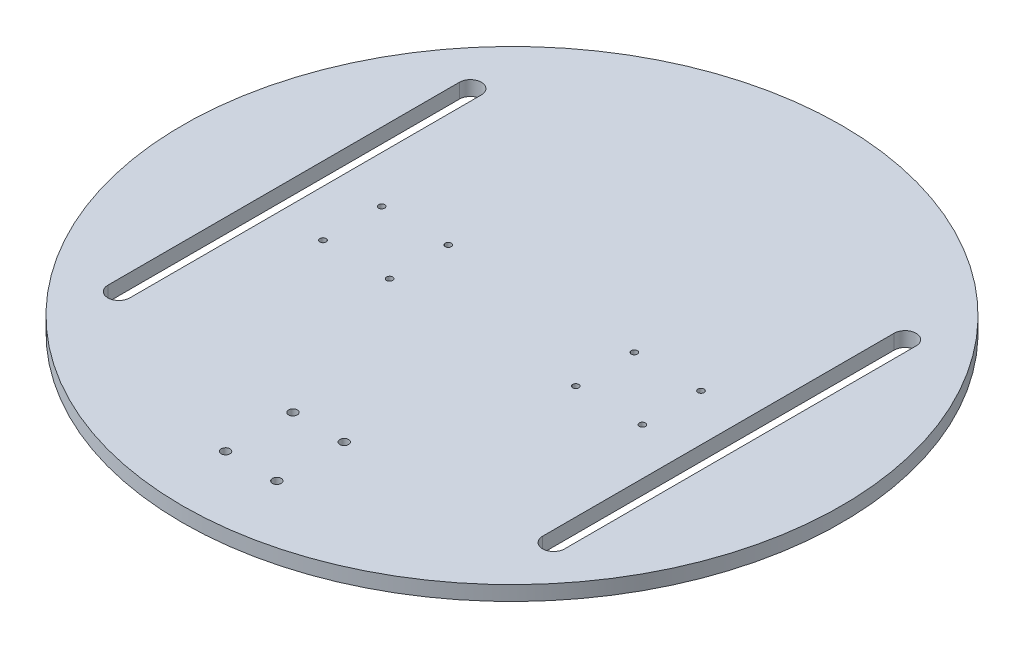
ISO-10303-21;
HEADER;
FILE_DESCRIPTION(('STEP AP214'),'2;1');
FILE_NAME('part.step','',(''),(''),'','','');
FILE_SCHEMA(('AUTOMOTIVE_DESIGN { 1 0 10303 214 1 1 1 1 }'));
ENDSEC;
DATA;
#1=APPLICATION_CONTEXT('core data for automotive mechanical design processes');
#2=APPLICATION_PROTOCOL_DEFINITION('international standard','automotive_design',2000,#1);
#3=PRODUCT_CONTEXT('',#1,'mechanical');
#4=PRODUCT('Part','Part','',(#3));
#5=PRODUCT_RELATED_PRODUCT_CATEGORY('part','',(#4));
#6=PRODUCT_DEFINITION_FORMATION('','',#4);
#7=PRODUCT_DEFINITION_CONTEXT('part definition',#1,'design');
#8=PRODUCT_DEFINITION('design','',#6,#7);
#9=PRODUCT_DEFINITION_SHAPE('','',#8);
#10=(LENGTH_UNIT() NAMED_UNIT(*) SI_UNIT(.MILLI.,.METRE.));
#11=(NAMED_UNIT(*) PLANE_ANGLE_UNIT() SI_UNIT($,.RADIAN.));
#12=(NAMED_UNIT(*) SI_UNIT($,.STERADIAN.) SOLID_ANGLE_UNIT());
#13=UNCERTAINTY_MEASURE_WITH_UNIT(LENGTH_MEASURE(1.E-05),#10,'distance_accuracy_value','');
#14=(GEOMETRIC_REPRESENTATION_CONTEXT(3) GLOBAL_UNCERTAINTY_ASSIGNED_CONTEXT((#13)) GLOBAL_UNIT_ASSIGNED_CONTEXT((#10,
#11,#12)) REPRESENTATION_CONTEXT('',''));
#15=CARTESIAN_POINT('',(0.,0.,0.));
#16=DIRECTION('',(0.,0.,1.));
#17=DIRECTION('',(1.,0.,0.));
#18=AXIS2_PLACEMENT_3D('',#15,#16,#17);
#19=CARTESIAN_POINT('',(0.,10.,0.));
#20=DIRECTION('',(0.,1.,0.));
#21=DIRECTION('',(0.,0.,1.));
#22=AXIS2_PLACEMENT_3D('',#19,#20,#21);
#23=PLANE('',#22);
#24=CARTESIAN_POINT('',(109.034473383909,10.,20.));
#25=DIRECTION('',(0.,-1.,0.));
#26=DIRECTION('',(0.,0.,-1.));
#27=AXIS2_PLACEMENT_3D('',#24,#25,#26);
#28=CIRCLE('',#27,2.1);
#29=CARTESIAN_POINT('',(109.034473383909,10.,17.9));
#30=VERTEX_POINT('',#29);
#31=EDGE_CURVE('E218',#30,#30,#28,.T.);
#32=ORIENTED_EDGE('',*,*,#31,.T.);
#33=EDGE_LOOP('',(#32));
#34=FACE_BOUND('',#33,.T.);
#35=CARTESIAN_POINT('',(-109.034473383909,10.,-20.));
#36=DIRECTION('',(0.,-1.,0.));
#37=DIRECTION('',(0.,0.,-1.));
#38=AXIS2_PLACEMENT_3D('',#35,#36,#37);
#39=CIRCLE('',#38,2.1);
#40=CARTESIAN_POINT('',(-109.034473383909,10.,-22.1));
#41=VERTEX_POINT('',#40);
#42=EDGE_CURVE('E222',#41,#41,#39,.T.);
#43=ORIENTED_EDGE('',*,*,#42,.T.);
#44=EDGE_LOOP('',(#43));
#45=FACE_BOUND('',#44,.T.);
#46=CARTESIAN_POINT('',(-63.5330170376186,10.,20.));
#47=DIRECTION('',(0.,-1.,0.));
#48=DIRECTION('',(0.,0.,-1.));
#49=AXIS2_PLACEMENT_3D('',#46,#47,#48);
#50=CIRCLE('',#49,2.1);
#51=CARTESIAN_POINT('',(-63.5330170376186,10.,17.9));
#52=VERTEX_POINT('',#51);
#53=EDGE_CURVE('E226',#52,#52,#50,.T.);
#54=ORIENTED_EDGE('',*,*,#53,.T.);
#55=EDGE_LOOP('',(#54));
#56=FACE_BOUND('',#55,.T.);
#57=CARTESIAN_POINT('',(63.5330170376186,10.,-20.));
#58=DIRECTION('',(0.,1.,0.));
#59=DIRECTION('',(0.,0.,1.));
#60=AXIS2_PLACEMENT_3D('',#57,#58,#59);
#61=CIRCLE('',#60,2.1);
#62=CARTESIAN_POINT('',(63.5330170376186,10.,-17.9));
#63=VERTEX_POINT('',#62);
#64=EDGE_CURVE('E230',#63,#63,#61,.F.);
#65=ORIENTED_EDGE('',*,*,#64,.T.);
#66=EDGE_LOOP('',(#65));
#67=FACE_BOUND('',#66,.T.);
#68=CARTESIAN_POINT('',(63.5330170376186,10.,20.));
#69=DIRECTION('',(0.,1.,0.));
#70=DIRECTION('',(0.,0.,1.));
#71=AXIS2_PLACEMENT_3D('',#68,#69,#70);
#72=CIRCLE('',#71,2.1);
#73=CARTESIAN_POINT('',(63.5330170376186,10.,22.1));
#74=VERTEX_POINT('',#73);
#75=EDGE_CURVE('E234',#74,#74,#72,.T.);
#76=ORIENTED_EDGE('',*,*,#75,.F.);
#77=EDGE_LOOP('',(#76));
#78=FACE_BOUND('',#77,.T.);
#79=CARTESIAN_POINT('',(17.5000000000001,10.,178.051038191247));
#80=DIRECTION('',(0.,1.,0.));
#81=DIRECTION('',(0.,0.,1.));
#82=AXIS2_PLACEMENT_3D('',#79,#80,#81);
#83=CIRCLE('',#82,3.);
#84=CARTESIAN_POINT('',(17.5000000000001,10.,181.051038191247));
#85=VERTEX_POINT('',#84);
#86=EDGE_CURVE('E175',#85,#85,#83,.T.);
#87=ORIENTED_EDGE('',*,*,#86,.F.);
#88=EDGE_LOOP('',(#87));
#89=FACE_BOUND('',#88,.T.);
#90=CARTESIAN_POINT('',(-17.4999999999999,10.,132.051038191247));
#91=DIRECTION('',(0.,1.,0.));
#92=DIRECTION('',(0.,0.,1.));
#93=AXIS2_PLACEMENT_3D('',#90,#91,#92);
#94=CIRCLE('',#93,3.);
#95=CARTESIAN_POINT('',(-17.4999999999999,10.,135.051038191247));
#96=VERTEX_POINT('',#95);
#97=EDGE_CURVE('E187',#96,#96,#94,.T.);
#98=ORIENTED_EDGE('',*,*,#97,.F.);
#99=EDGE_LOOP('',(#98));
#100=FACE_BOUND('',#99,.T.);
#101=CARTESIAN_POINT('',(0.,10.,0.));
#102=DIRECTION('',(0.,1.,0.));
#103=DIRECTION('',(0.,0.,1.));
#104=AXIS2_PLACEMENT_3D('',#101,#102,#103);
#105=CIRCLE('',#104,225.);
#106=CARTESIAN_POINT('',(0.,10.,225.));
#107=VERTEX_POINT('',#106);
#108=EDGE_CURVE('E11',#107,#107,#105,.T.);
#109=ORIENTED_EDGE('',*,*,#108,.T.);
#110=EDGE_LOOP('',(#109));
#111=FACE_BOUND('',#110,.T.);
#112=CARTESIAN_POINT('',(17.5000000000001,10.,132.051038191247));
#113=DIRECTION('',(0.,1.,0.));
#114=DIRECTION('',(0.,0.,1.));
#115=AXIS2_PLACEMENT_3D('',#112,#113,#114);
#116=CIRCLE('',#115,3.);
#117=CARTESIAN_POINT('',(17.5000000000001,10.,135.051038191247));
#118=VERTEX_POINT('',#117);
#119=EDGE_CURVE('E181',#118,#118,#116,.T.);
#120=ORIENTED_EDGE('',*,*,#119,.F.);
#121=EDGE_LOOP('',(#120));
#122=FACE_BOUND('',#121,.T.);
#123=CARTESIAN_POINT('',(-17.4999999999999,10.,178.051038191247));
#124=DIRECTION('',(0.,1.,0.));
#125=DIRECTION('',(0.,0.,1.));
#126=AXIS2_PLACEMENT_3D('',#123,#124,#125);
#127=CIRCLE('',#126,3.);
#128=CARTESIAN_POINT('',(-17.4999999999999,10.,181.051038191247));
#129=VERTEX_POINT('',#128);
#130=EDGE_CURVE('E169',#129,#129,#127,.T.);
#131=ORIENTED_EDGE('',*,*,#130,.F.);
#132=EDGE_LOOP('',(#131));
#133=FACE_BOUND('',#132,.T.);
#134=DIRECTION('',(0.,0.,-1.));
#135=VECTOR('',#134,1.);
#136=CARTESIAN_POINT('',(-140.906854679595,10.,120.));
#137=LINE('',#136,#135);
#138=CARTESIAN_POINT('',(-140.906854679595,10.,120.));
#139=VERTEX_POINT('',#138);
#140=CARTESIAN_POINT('',(-140.906854679595,10.,-120.));
#141=VERTEX_POINT('',#140);
#142=EDGE_CURVE('E140',#139,#141,#137,.T.);
#143=ORIENTED_EDGE('',*,*,#142,.F.);
#144=CARTESIAN_POINT('',(-148.406854679595,10.,120.));
#145=DIRECTION('',(0.,1.,0.));
#146=DIRECTION('',(0.,0.,1.));
#147=AXIS2_PLACEMENT_3D('',#144,#145,#146);
#148=CIRCLE('',#147,7.50000000000001);
#149=CARTESIAN_POINT('',(-155.906854679595,10.,120.));
#150=VERTEX_POINT('',#149);
#151=EDGE_CURVE('E138',#150,#139,#148,.T.);
#152=ORIENTED_EDGE('',*,*,#151,.F.);
#153=DIRECTION('',(0.,0.,1.));
#154=VECTOR('',#153,1.);
#155=CARTESIAN_POINT('',(-155.906854679595,10.,120.));
#156=LINE('',#155,#154);
#157=CARTESIAN_POINT('',(-155.906854679595,10.,-120.));
#158=VERTEX_POINT('',#157);
#159=EDGE_CURVE('E146',#158,#150,#156,.T.);
#160=ORIENTED_EDGE('',*,*,#159,.F.);
#161=CARTESIAN_POINT('',(-148.406854679595,10.,-120.));
#162=DIRECTION('',(0.,1.,0.));
#163=DIRECTION('',(0.,0.,1.));
#164=AXIS2_PLACEMENT_3D('',#161,#162,#163);
#165=CIRCLE('',#164,7.50000000000001);
#166=EDGE_CURVE('E143',#141,#158,#165,.T.);
#167=ORIENTED_EDGE('',*,*,#166,.F.);
#168=EDGE_LOOP('',(#143,#152,#160,#167));
#169=FACE_BOUND('',#168,.T.);
#170=DIRECTION('',(0.,0.,-1.));
#171=VECTOR('',#170,1.);
#172=CARTESIAN_POINT('',(155.906854679595,10.,120.));
#173=LINE('',#172,#171);
#174=CARTESIAN_POINT('',(155.906854679595,10.,120.));
#175=VERTEX_POINT('',#174);
#176=CARTESIAN_POINT('',(155.906854679595,10.,-120.));
#177=VERTEX_POINT('',#176);
#178=EDGE_CURVE('E107',#175,#177,#173,.T.);
#179=ORIENTED_EDGE('',*,*,#178,.F.);
#180=CARTESIAN_POINT('',(148.406854679595,10.,120.));
#181=DIRECTION('',(0.,1.,0.));
#182=DIRECTION('',(0.,0.,-1.));
#183=AXIS2_PLACEMENT_3D('',#180,#181,#182);
#184=CIRCLE('',#183,7.50000000000001);
#185=CARTESIAN_POINT('',(140.906854679595,10.,120.));
#186=VERTEX_POINT('',#185);
#187=EDGE_CURVE('E99',#186,#175,#184,.T.);
#188=ORIENTED_EDGE('',*,*,#187,.F.);
#189=DIRECTION('',(0.,0.,1.));
#190=VECTOR('',#189,1.);
#191=CARTESIAN_POINT('',(140.906854679595,10.,120.));
#192=LINE('',#191,#190);
#193=CARTESIAN_POINT('',(140.906854679595,10.,-120.));
#194=VERTEX_POINT('',#193);
#195=EDGE_CURVE('E122',#194,#186,#192,.T.);
#196=ORIENTED_EDGE('',*,*,#195,.F.);
#197=CARTESIAN_POINT('',(148.406854679595,10.,-120.));
#198=DIRECTION('',(0.,1.,0.));
#199=DIRECTION('',(0.,0.,-1.));
#200=AXIS2_PLACEMENT_3D('',#197,#198,#199);
#201=CIRCLE('',#200,7.50000000000001);
#202=EDGE_CURVE('E120',#177,#194,#201,.T.);
#203=ORIENTED_EDGE('',*,*,#202,.F.);
#204=EDGE_LOOP('',(#179,#188,#196,#203));
#205=FACE_BOUND('',#204,.T.);
#206=CARTESIAN_POINT('',(-109.034473383909,10.,20.));
#207=DIRECTION('',(0.,1.,0.));
#208=DIRECTION('',(0.,0.,1.));
#209=AXIS2_PLACEMENT_3D('',#206,#207,#208);
#210=CIRCLE('',#209,2.1);
#211=CARTESIAN_POINT('',(-109.034473383909,10.,22.1));
#212=VERTEX_POINT('',#211);
#213=EDGE_CURVE('E465',#212,#212,#210,.T.);
#214=ORIENTED_EDGE('',*,*,#213,.F.);
#215=EDGE_LOOP('',(#214));
#216=FACE_BOUND('',#215,.T.);
#217=CARTESIAN_POINT('',(-63.5330170376186,10.,-20.));
#218=DIRECTION('',(0.,1.,0.));
#219=DIRECTION('',(0.,0.,1.));
#220=AXIS2_PLACEMENT_3D('',#217,#218,#219);
#221=CIRCLE('',#220,2.1);
#222=CARTESIAN_POINT('',(-63.5330170376186,10.,-17.9));
#223=VERTEX_POINT('',#222);
#224=EDGE_CURVE('E471',#223,#223,#221,.T.);
#225=ORIENTED_EDGE('',*,*,#224,.F.);
#226=EDGE_LOOP('',(#225));
#227=FACE_BOUND('',#226,.T.);
#228=CARTESIAN_POINT('',(109.034473383909,10.,-20.));
#229=DIRECTION('',(0.,1.,0.));
#230=DIRECTION('',(0.,0.,1.));
#231=AXIS2_PLACEMENT_3D('',#228,#229,#230);
#232=CIRCLE('',#231,2.1);
#233=CARTESIAN_POINT('',(109.034473383909,10.,-17.9));
#234=VERTEX_POINT('',#233);
#235=EDGE_CURVE('E448',#234,#234,#232,.T.);
#236=ORIENTED_EDGE('',*,*,#235,.F.);
#237=EDGE_LOOP('',(#236));
#238=FACE_BOUND('',#237,.T.);
#239=ADVANCED_FACE('F34',(#34,#45,#56,#67,#78,#89,#100,#111,#122,#133,#169,#205,#216,#227,#238),
#23,.T.);
#240=CARTESIAN_POINT('',(0.,0.,0.));
#241=DIRECTION('',(0.,1.,0.));
#242=DIRECTION('',(0.,0.,1.));
#243=AXIS2_PLACEMENT_3D('',#240,#241,#242);
#244=PLANE('',#243);
#245=CARTESIAN_POINT('',(-63.5330170376186,0.,-20.));
#246=DIRECTION('',(0.,1.,0.));
#247=DIRECTION('',(0.,0.,1.));
#248=AXIS2_PLACEMENT_3D('',#245,#246,#247);
#249=CIRCLE('',#248,2.1);
#250=CARTESIAN_POINT('',(-63.5330170376186,0.,-17.9));
#251=VERTEX_POINT('',#250);
#252=EDGE_CURVE('E492',#251,#251,#249,.T.);
#253=ORIENTED_EDGE('',*,*,#252,.T.);
#254=EDGE_LOOP('',(#253));
#255=FACE_BOUND('',#254,.T.);
#256=CARTESIAN_POINT('',(148.406854679595,0.,120.));
#257=DIRECTION('',(0.,1.,0.));
#258=DIRECTION('',(0.,0.,-1.));
#259=AXIS2_PLACEMENT_3D('',#256,#257,#258);
#260=CIRCLE('',#259,7.50000000000001);
#261=CARTESIAN_POINT('',(140.906854679595,0.,120.));
#262=VERTEX_POINT('',#261);
#263=CARTESIAN_POINT('',(155.906854679595,0.,120.));
#264=VERTEX_POINT('',#263);
#265=EDGE_CURVE('E57',#262,#264,#260,.T.);
#266=ORIENTED_EDGE('',*,*,#265,.T.);
#267=DIRECTION('',(0.,0.,-1.));
#268=VECTOR('',#267,1.);
#269=CARTESIAN_POINT('',(155.906854679595,0.,120.));
#270=LINE('',#269,#268);
#271=CARTESIAN_POINT('',(155.906854679595,0.,-120.));
#272=VERTEX_POINT('',#271);
#273=EDGE_CURVE('E114',#264,#272,#270,.T.);
#274=ORIENTED_EDGE('',*,*,#273,.T.);
#275=CARTESIAN_POINT('',(148.406854679595,0.,-120.));
#276=DIRECTION('',(0.,1.,0.));
#277=DIRECTION('',(0.,0.,-1.));
#278=AXIS2_PLACEMENT_3D('',#275,#276,#277);
#279=CIRCLE('',#278,7.50000000000001);
#280=CARTESIAN_POINT('',(140.906854679595,0.,-120.));
#281=VERTEX_POINT('',#280);
#282=EDGE_CURVE('E130',#272,#281,#279,.T.);
#283=ORIENTED_EDGE('',*,*,#282,.T.);
#284=DIRECTION('',(0.,0.,1.));
#285=VECTOR('',#284,1.);
#286=CARTESIAN_POINT('',(140.906854679595,0.,120.));
#287=LINE('',#286,#285);
#288=EDGE_CURVE('E108',#281,#262,#287,.T.);
#289=ORIENTED_EDGE('',*,*,#288,.T.);
#290=EDGE_LOOP('',(#266,#274,#283,#289));
#291=FACE_BOUND('',#290,.T.);
#292=CARTESIAN_POINT('',(-17.4999999999999,0.,178.051038191247));
#293=DIRECTION('',(0.,1.,0.));
#294=DIRECTION('',(0.,0.,1.));
#295=AXIS2_PLACEMENT_3D('',#292,#293,#294);
#296=CIRCLE('',#295,3.);
#297=CARTESIAN_POINT('',(-17.4999999999999,0.,181.051038191247));
#298=VERTEX_POINT('',#297);
#299=EDGE_CURVE('E168',#298,#298,#296,.T.);
#300=ORIENTED_EDGE('',*,*,#299,.T.);
#301=EDGE_LOOP('',(#300));
#302=FACE_BOUND('',#301,.T.);
#303=CARTESIAN_POINT('',(17.5000000000001,0.,178.051038191247));
#304=DIRECTION('',(0.,1.,0.));
#305=DIRECTION('',(0.,0.,1.));
#306=AXIS2_PLACEMENT_3D('',#303,#304,#305);
#307=CIRCLE('',#306,3.);
#308=CARTESIAN_POINT('',(17.5000000000001,0.,181.051038191247));
#309=VERTEX_POINT('',#308);
#310=EDGE_CURVE('E172',#309,#309,#307,.T.);
#311=ORIENTED_EDGE('',*,*,#310,.T.);
#312=EDGE_LOOP('',(#311));
#313=FACE_BOUND('',#312,.T.);
#314=CARTESIAN_POINT('',(17.5000000000001,0.,132.051038191247));
#315=DIRECTION('',(0.,1.,0.));
#316=DIRECTION('',(0.,0.,1.));
#317=AXIS2_PLACEMENT_3D('',#314,#315,#316);
#318=CIRCLE('',#317,3.);
#319=CARTESIAN_POINT('',(17.5000000000001,0.,135.051038191247));
#320=VERTEX_POINT('',#319);
#321=EDGE_CURVE('E178',#320,#320,#318,.T.);
#322=ORIENTED_EDGE('',*,*,#321,.T.);
#323=EDGE_LOOP('',(#322));
#324=FACE_BOUND('',#323,.T.);
#325=CARTESIAN_POINT('',(-17.4999999999999,0.,132.051038191247));
#326=DIRECTION('',(0.,1.,0.));
#327=DIRECTION('',(0.,0.,1.));
#328=AXIS2_PLACEMENT_3D('',#325,#326,#327);
#329=CIRCLE('',#328,3.);
#330=CARTESIAN_POINT('',(-17.4999999999999,0.,135.051038191247));
#331=VERTEX_POINT('',#330);
#332=EDGE_CURVE('E184',#331,#331,#329,.T.);
#333=ORIENTED_EDGE('',*,*,#332,.T.);
#334=EDGE_LOOP('',(#333));
#335=FACE_BOUND('',#334,.T.);
#336=CARTESIAN_POINT('',(0.,0.,0.));
#337=DIRECTION('',(0.,1.,0.));
#338=DIRECTION('',(0.,0.,1.));
#339=AXIS2_PLACEMENT_3D('',#336,#337,#338);
#340=CIRCLE('',#339,225.);
#341=CARTESIAN_POINT('',(0.,0.,225.));
#342=VERTEX_POINT('',#341);
#343=EDGE_CURVE('E38',#342,#342,#340,.T.);
#344=ORIENTED_EDGE('',*,*,#343,.F.);
#345=EDGE_LOOP('',(#344));
#346=FACE_BOUND('',#345,.T.);
#347=CARTESIAN_POINT('',(-148.406854679595,0.,120.));
#348=DIRECTION('',(0.,1.,0.));
#349=DIRECTION('',(0.,0.,1.));
#350=AXIS2_PLACEMENT_3D('',#347,#348,#349);
#351=CIRCLE('',#350,7.50000000000001);
#352=CARTESIAN_POINT('',(-155.906854679595,0.,120.));
#353=VERTEX_POINT('',#352);
#354=CARTESIAN_POINT('',(-140.906854679595,0.,120.));
#355=VERTEX_POINT('',#354);
#356=EDGE_CURVE('E115',#353,#355,#351,.T.);
#357=ORIENTED_EDGE('',*,*,#356,.T.);
#358=DIRECTION('',(0.,0.,-1.));
#359=VECTOR('',#358,1.);
#360=CARTESIAN_POINT('',(-140.906854679595,0.,120.));
#361=LINE('',#360,#359);
#362=CARTESIAN_POINT('',(-140.906854679595,0.,-120.));
#363=VERTEX_POINT('',#362);
#364=EDGE_CURVE('E151',#355,#363,#361,.T.);
#365=ORIENTED_EDGE('',*,*,#364,.T.);
#366=CARTESIAN_POINT('',(-148.406854679595,0.,-120.));
#367=DIRECTION('',(0.,1.,0.));
#368=DIRECTION('',(0.,0.,1.));
#369=AXIS2_PLACEMENT_3D('',#366,#367,#368);
#370=CIRCLE('',#369,7.50000000000001);
#371=CARTESIAN_POINT('',(-155.906854679595,0.,-120.));
#372=VERTEX_POINT('',#371);
#373=EDGE_CURVE('E154',#363,#372,#370,.T.);
#374=ORIENTED_EDGE('',*,*,#373,.T.);
#375=DIRECTION('',(0.,0.,1.));
#376=VECTOR('',#375,1.);
#377=CARTESIAN_POINT('',(-155.906854679595,0.,120.));
#378=LINE('',#377,#376);
#379=EDGE_CURVE('E141',#372,#353,#378,.T.);
#380=ORIENTED_EDGE('',*,*,#379,.T.);
#381=EDGE_LOOP('',(#357,#365,#374,#380));
#382=FACE_BOUND('',#381,.T.);
#383=CARTESIAN_POINT('',(63.5330170376186,0.,20.));
#384=DIRECTION('',(0.,1.,0.));
#385=DIRECTION('',(0.,0.,1.));
#386=AXIS2_PLACEMENT_3D('',#383,#384,#385);
#387=CIRCLE('',#386,2.1);
#388=CARTESIAN_POINT('',(63.5330170376186,0.,22.1));
#389=VERTEX_POINT('',#388);
#390=EDGE_CURVE('E128',#389,#389,#387,.T.);
#391=ORIENTED_EDGE('',*,*,#390,.T.);
#392=EDGE_LOOP('',(#391));
#393=FACE_BOUND('',#392,.T.);
#394=CARTESIAN_POINT('',(63.5330170376186,0.,-20.));
#395=DIRECTION('',(0.,1.,0.));
#396=DIRECTION('',(0.,0.,1.));
#397=AXIS2_PLACEMENT_3D('',#394,#395,#396);
#398=CIRCLE('',#397,2.1);
#399=CARTESIAN_POINT('',(63.5330170376186,0.,-17.9));
#400=VERTEX_POINT('',#399);
#401=EDGE_CURVE('E458',#400,#400,#398,.F.);
#402=ORIENTED_EDGE('',*,*,#401,.F.);
#403=EDGE_LOOP('',(#402));
#404=FACE_BOUND('',#403,.T.);
#405=CARTESIAN_POINT('',(-63.5330170376186,0.,20.));
#406=DIRECTION('',(0.,-1.,0.));
#407=DIRECTION('',(0.,0.,-1.));
#408=AXIS2_PLACEMENT_3D('',#405,#406,#407);
#409=CIRCLE('',#408,2.1);
#410=CARTESIAN_POINT('',(-63.5330170376186,0.,17.9));
#411=VERTEX_POINT('',#410);
#412=EDGE_CURVE('E462',#411,#411,#409,.T.);
#413=ORIENTED_EDGE('',*,*,#412,.F.);
#414=EDGE_LOOP('',(#413));
#415=FACE_BOUND('',#414,.T.);
#416=CARTESIAN_POINT('',(-109.034473383909,0.,20.));
#417=DIRECTION('',(0.,1.,0.));
#418=DIRECTION('',(0.,0.,1.));
#419=AXIS2_PLACEMENT_3D('',#416,#417,#418);
#420=CIRCLE('',#419,2.1);
#421=CARTESIAN_POINT('',(-109.034473383909,0.,22.1));
#422=VERTEX_POINT('',#421);
#423=EDGE_CURVE('E468',#422,#422,#420,.T.);
#424=ORIENTED_EDGE('',*,*,#423,.T.);
#425=EDGE_LOOP('',(#424));
#426=FACE_BOUND('',#425,.T.);
#427=CARTESIAN_POINT('',(-109.034473383909,0.,-20.));
#428=DIRECTION('',(0.,-1.,0.));
#429=DIRECTION('',(0.,0.,-1.));
#430=AXIS2_PLACEMENT_3D('',#427,#428,#429);
#431=CIRCLE('',#430,2.1);
#432=CARTESIAN_POINT('',(-109.034473383909,0.,-22.1));
#433=VERTEX_POINT('',#432);
#434=EDGE_CURVE('E485',#433,#433,#431,.T.);
#435=ORIENTED_EDGE('',*,*,#434,.F.);
#436=EDGE_LOOP('',(#435));
#437=FACE_BOUND('',#436,.T.);
#438=CARTESIAN_POINT('',(109.034473383909,0.,20.));
#439=DIRECTION('',(0.,-1.,0.));
#440=DIRECTION('',(0.,0.,-1.));
#441=AXIS2_PLACEMENT_3D('',#438,#439,#440);
#442=CIRCLE('',#441,2.1);
#443=CARTESIAN_POINT('',(109.034473383909,0.,17.9));
#444=VERTEX_POINT('',#443);
#445=EDGE_CURVE('E450',#444,#444,#442,.T.);
#446=ORIENTED_EDGE('',*,*,#445,.F.);
#447=EDGE_LOOP('',(#446));
#448=FACE_BOUND('',#447,.T.);
#449=CARTESIAN_POINT('',(109.034473383909,0.,-20.));
#450=DIRECTION('',(0.,1.,0.));
#451=DIRECTION('',(0.,0.,1.));
#452=AXIS2_PLACEMENT_3D('',#449,#450,#451);
#453=CIRCLE('',#452,2.1);
#454=CARTESIAN_POINT('',(109.034473383909,0.,-17.9));
#455=VERTEX_POINT('',#454);
#456=EDGE_CURVE('E445',#455,#455,#453,.T.);
#457=ORIENTED_EDGE('',*,*,#456,.T.);
#458=EDGE_LOOP('',(#457));
#459=FACE_BOUND('',#458,.T.);
#460=ADVANCED_FACE('F193',(#255,#291,#302,#313,#324,#335,#346,#382,#393,#404,#415,#426,#437,
#448,#459),#244,.F.);
#461=CARTESIAN_POINT('',(0.,10.,0.));
#462=DIRECTION('',(0.,-1.,0.));
#463=DIRECTION('',(0.,0.,-1.));
#464=AXIS2_PLACEMENT_3D('',#461,#462,#463);
#465=CYLINDRICAL_SURFACE('',#464,225.);
#466=ORIENTED_EDGE('',*,*,#108,.F.);
#467=EDGE_LOOP('',(#466));
#468=FACE_BOUND('',#467,.T.);
#469=ORIENTED_EDGE('',*,*,#343,.T.);
#470=EDGE_LOOP('',(#469));
#471=FACE_BOUND('',#470,.T.);
#472=ADVANCED_FACE('F36',(#468,#471),#465,.T.);
#473=CARTESIAN_POINT('',(-17.4999999999999,10.,132.051038191247));
#474=DIRECTION('',(0.,-1.,0.));
#475=DIRECTION('',(0.,0.,-1.));
#476=AXIS2_PLACEMENT_3D('',#473,#474,#475);
#477=CYLINDRICAL_SURFACE('',#476,3.);
#478=ORIENTED_EDGE('',*,*,#97,.T.);
#479=EDGE_LOOP('',(#478));
#480=FACE_BOUND('',#479,.T.);
#481=ORIENTED_EDGE('',*,*,#332,.F.);
#482=EDGE_LOOP('',(#481));
#483=FACE_BOUND('',#482,.T.);
#484=ADVANCED_FACE('F196',(#480,#483),#477,.F.);
#485=CARTESIAN_POINT('',(17.5000000000001,10.,132.051038191247));
#486=DIRECTION('',(0.,-1.,0.));
#487=DIRECTION('',(0.,0.,-1.));
#488=AXIS2_PLACEMENT_3D('',#485,#486,#487);
#489=CYLINDRICAL_SURFACE('',#488,3.);
#490=ORIENTED_EDGE('',*,*,#119,.T.);
#491=EDGE_LOOP('',(#490));
#492=FACE_BOUND('',#491,.T.);
#493=ORIENTED_EDGE('',*,*,#321,.F.);
#494=EDGE_LOOP('',(#493));
#495=FACE_BOUND('',#494,.T.);
#496=ADVANCED_FACE('F198',(#492,#495),#489,.F.);
#497=CARTESIAN_POINT('',(17.5000000000001,10.,178.051038191247));
#498=DIRECTION('',(0.,-1.,0.));
#499=DIRECTION('',(0.,0.,-1.));
#500=AXIS2_PLACEMENT_3D('',#497,#498,#499);
#501=CYLINDRICAL_SURFACE('',#500,3.);
#502=ORIENTED_EDGE('',*,*,#86,.T.);
#503=EDGE_LOOP('',(#502));
#504=FACE_BOUND('',#503,.T.);
#505=ORIENTED_EDGE('',*,*,#310,.F.);
#506=EDGE_LOOP('',(#505));
#507=FACE_BOUND('',#506,.T.);
#508=ADVANCED_FACE('F205',(#504,#507),#501,.F.);
#509=CARTESIAN_POINT('',(-17.4999999999999,10.,178.051038191247));
#510=DIRECTION('',(0.,-1.,0.));
#511=DIRECTION('',(0.,0.,-1.));
#512=AXIS2_PLACEMENT_3D('',#509,#510,#511);
#513=CYLINDRICAL_SURFACE('',#512,3.);
#514=ORIENTED_EDGE('',*,*,#130,.T.);
#515=EDGE_LOOP('',(#514));
#516=FACE_BOUND('',#515,.T.);
#517=ORIENTED_EDGE('',*,*,#299,.F.);
#518=EDGE_LOOP('',(#517));
#519=FACE_BOUND('',#518,.T.);
#520=ADVANCED_FACE('F278',(#516,#519),#513,.F.);
#521=CARTESIAN_POINT('',(-148.406854679595,10.,120.));
#522=DIRECTION('',(0.,-1.,0.));
#523=DIRECTION('',(0.,0.,-1.));
#524=AXIS2_PLACEMENT_3D('',#521,#522,#523);
#525=CYLINDRICAL_SURFACE('',#524,7.50000000000001);
#526=ORIENTED_EDGE('',*,*,#356,.F.);
#527=DIRECTION('',(0.,-1.,0.));
#528=VECTOR('',#527,1.);
#529=CARTESIAN_POINT('',(-155.906854679595,10.,120.));
#530=LINE('',#529,#528);
#531=EDGE_CURVE('E148',#150,#353,#530,.T.);
#532=ORIENTED_EDGE('',*,*,#531,.F.);
#533=ORIENTED_EDGE('',*,*,#151,.T.);
#534=DIRECTION('',(0.,-1.,0.));
#535=VECTOR('',#534,1.);
#536=CARTESIAN_POINT('',(-140.906854679595,10.,120.));
#537=LINE('',#536,#535);
#538=EDGE_CURVE('E165',#139,#355,#537,.T.);
#539=ORIENTED_EDGE('',*,*,#538,.T.);
#540=EDGE_LOOP('',(#526,#532,#533,#539));
#541=FACE_BOUND('',#540,.T.);
#542=ADVANCED_FACE('F260',(#541),#525,.F.);
#543=CARTESIAN_POINT('',(-140.906854679595,10.,120.));
#544=DIRECTION('',(-1.,0.,0.));
#545=DIRECTION('',(0.,0.,1.));
#546=AXIS2_PLACEMENT_3D('',#543,#544,#545);
#547=PLANE('',#546);
#548=ORIENTED_EDGE('',*,*,#364,.F.);
#549=ORIENTED_EDGE('',*,*,#538,.F.);
#550=ORIENTED_EDGE('',*,*,#142,.T.);
#551=DIRECTION('',(0.,-1.,0.));
#552=VECTOR('',#551,1.);
#553=CARTESIAN_POINT('',(-140.906854679595,10.,-120.));
#554=LINE('',#553,#552);
#555=EDGE_CURVE('E163',#141,#363,#554,.T.);
#556=ORIENTED_EDGE('',*,*,#555,.T.);
#557=EDGE_LOOP('',(#548,#549,#550,#556));
#558=FACE_BOUND('',#557,.T.);
#559=ADVANCED_FACE('F252',(#558),#547,.T.);
#560=CARTESIAN_POINT('',(-148.406854679595,10.,-120.));
#561=DIRECTION('',(0.,-1.,0.));
#562=DIRECTION('',(0.,0.,-1.));
#563=AXIS2_PLACEMENT_3D('',#560,#561,#562);
#564=CYLINDRICAL_SURFACE('',#563,7.50000000000001);
#565=ORIENTED_EDGE('',*,*,#373,.F.);
#566=ORIENTED_EDGE('',*,*,#555,.F.);
#567=ORIENTED_EDGE('',*,*,#166,.T.);
#568=DIRECTION('',(0.,-1.,0.));
#569=VECTOR('',#568,1.);
#570=CARTESIAN_POINT('',(-155.906854679595,10.,-120.));
#571=LINE('',#570,#569);
#572=EDGE_CURVE('E161',#158,#372,#571,.T.);
#573=ORIENTED_EDGE('',*,*,#572,.T.);
#574=EDGE_LOOP('',(#565,#566,#567,#573));
#575=FACE_BOUND('',#574,.T.);
#576=ADVANCED_FACE('F255',(#575),#564,.F.);
#577=CARTESIAN_POINT('',(-155.906854679595,10.,120.));
#578=DIRECTION('',(1.,0.,0.));
#579=DIRECTION('',(0.,0.,-1.));
#580=AXIS2_PLACEMENT_3D('',#577,#578,#579);
#581=PLANE('',#580);
#582=ORIENTED_EDGE('',*,*,#379,.F.);
#583=ORIENTED_EDGE('',*,*,#572,.F.);
#584=ORIENTED_EDGE('',*,*,#159,.T.);
#585=ORIENTED_EDGE('',*,*,#531,.T.);
#586=EDGE_LOOP('',(#582,#583,#584,#585));
#587=FACE_BOUND('',#586,.T.);
#588=ADVANCED_FACE('F263',(#587),#581,.T.);
#589=CARTESIAN_POINT('',(148.406854679595,10.,120.));
#590=DIRECTION('',(0.,-1.,0.));
#591=DIRECTION('',(0.,0.,-1.));
#592=AXIS2_PLACEMENT_3D('',#589,#590,#591);
#593=CYLINDRICAL_SURFACE('',#592,7.50000000000001);
#594=ORIENTED_EDGE('',*,*,#265,.F.);
#595=DIRECTION('',(0.,-1.,0.));
#596=VECTOR('',#595,1.);
#597=CARTESIAN_POINT('',(140.906854679595,10.,120.));
#598=LINE('',#597,#596);
#599=EDGE_CURVE('E103',#186,#262,#598,.T.);
#600=ORIENTED_EDGE('',*,*,#599,.F.);
#601=ORIENTED_EDGE('',*,*,#187,.T.);
#602=DIRECTION('',(0.,-1.,0.));
#603=VECTOR('',#602,1.);
#604=CARTESIAN_POINT('',(155.906854679595,10.,120.));
#605=LINE('',#604,#603);
#606=EDGE_CURVE('E102',#175,#264,#605,.T.);
#607=ORIENTED_EDGE('',*,*,#606,.T.);
#608=EDGE_LOOP('',(#594,#600,#601,#607));
#609=FACE_BOUND('',#608,.T.);
#610=ADVANCED_FACE('F101',(#609),#593,.F.);
#611=CARTESIAN_POINT('',(155.906854679595,10.,120.));
#612=DIRECTION('',(-1.,0.,0.));
#613=DIRECTION('',(0.,0.,1.));
#614=AXIS2_PLACEMENT_3D('',#611,#612,#613);
#615=PLANE('',#614);
#616=ORIENTED_EDGE('',*,*,#273,.F.);
#617=ORIENTED_EDGE('',*,*,#606,.F.);
#618=ORIENTED_EDGE('',*,*,#178,.T.);
#619=DIRECTION('',(0.,-1.,0.));
#620=VECTOR('',#619,1.);
#621=CARTESIAN_POINT('',(155.906854679595,10.,-120.));
#622=LINE('',#621,#620);
#623=EDGE_CURVE('E116',#177,#272,#622,.T.);
#624=ORIENTED_EDGE('',*,*,#623,.T.);
#625=EDGE_LOOP('',(#616,#617,#618,#624));
#626=FACE_BOUND('',#625,.T.);
#627=ADVANCED_FACE('F111',(#626),#615,.T.);
#628=CARTESIAN_POINT('',(148.406854679595,10.,-120.));
#629=DIRECTION('',(0.,-1.,0.));
#630=DIRECTION('',(0.,0.,-1.));
#631=AXIS2_PLACEMENT_3D('',#628,#629,#630);
#632=CYLINDRICAL_SURFACE('',#631,7.50000000000001);
#633=ORIENTED_EDGE('',*,*,#282,.F.);
#634=ORIENTED_EDGE('',*,*,#623,.F.);
#635=ORIENTED_EDGE('',*,*,#202,.T.);
#636=DIRECTION('',(0.,-1.,0.));
#637=VECTOR('',#636,1.);
#638=CARTESIAN_POINT('',(140.906854679595,10.,-120.));
#639=LINE('',#638,#637);
#640=EDGE_CURVE('E49',#194,#281,#639,.T.);
#641=ORIENTED_EDGE('',*,*,#640,.T.);
#642=EDGE_LOOP('',(#633,#634,#635,#641));
#643=FACE_BOUND('',#642,.T.);
#644=ADVANCED_FACE('F329',(#643),#632,.F.);
#645=CARTESIAN_POINT('',(140.906854679595,10.,120.));
#646=DIRECTION('',(1.,0.,0.));
#647=DIRECTION('',(0.,0.,-1.));
#648=AXIS2_PLACEMENT_3D('',#645,#646,#647);
#649=PLANE('',#648);
#650=ORIENTED_EDGE('',*,*,#288,.F.);
#651=ORIENTED_EDGE('',*,*,#640,.F.);
#652=ORIENTED_EDGE('',*,*,#195,.T.);
#653=ORIENTED_EDGE('',*,*,#599,.T.);
#654=EDGE_LOOP('',(#650,#651,#652,#653));
#655=FACE_BOUND('',#654,.T.);
#656=ADVANCED_FACE('F337',(#655),#649,.T.);
#657=CARTESIAN_POINT('',(63.5330170376186,0.,20.));
#658=DIRECTION('',(0.,1.,0.));
#659=DIRECTION('',(0.,0.,1.));
#660=AXIS2_PLACEMENT_3D('',#657,#658,#659);
#661=CYLINDRICAL_SURFACE('',#660,2.1);
#662=ORIENTED_EDGE('',*,*,#390,.F.);
#663=EDGE_LOOP('',(#662));
#664=FACE_BOUND('',#663,.T.);
#665=ORIENTED_EDGE('',*,*,#75,.T.);
#666=EDGE_LOOP('',(#665));
#667=FACE_BOUND('',#666,.T.);
#668=ADVANCED_FACE('F347',(#664,#667),#661,.F.);
#669=CARTESIAN_POINT('',(63.5330170376186,0.,-20.));
#670=DIRECTION('',(0.,1.,0.));
#671=DIRECTION('',(0.,0.,1.));
#672=AXIS2_PLACEMENT_3D('',#669,#670,#671);
#673=CYLINDRICAL_SURFACE('',#672,2.1);
#674=ORIENTED_EDGE('',*,*,#401,.T.);
#675=EDGE_LOOP('',(#674));
#676=FACE_BOUND('',#675,.T.);
#677=ORIENTED_EDGE('',*,*,#64,.F.);
#678=EDGE_LOOP('',(#677));
#679=FACE_BOUND('',#678,.T.);
#680=ADVANCED_FACE('F368',(#676,#679),#673,.F.);
#681=CARTESIAN_POINT('',(-63.5330170376186,0.,20.));
#682=DIRECTION('',(0.,1.,0.));
#683=DIRECTION('',(0.,0.,1.));
#684=AXIS2_PLACEMENT_3D('',#681,#682,#683);
#685=CYLINDRICAL_SURFACE('',#684,2.1);
#686=ORIENTED_EDGE('',*,*,#412,.T.);
#687=EDGE_LOOP('',(#686));
#688=FACE_BOUND('',#687,.T.);
#689=ORIENTED_EDGE('',*,*,#53,.F.);
#690=EDGE_LOOP('',(#689));
#691=FACE_BOUND('',#690,.T.);
#692=ADVANCED_FACE('F378',(#688,#691),#685,.F.);
#693=CARTESIAN_POINT('',(-109.034473383909,0.,20.));
#694=DIRECTION('',(0.,1.,0.));
#695=DIRECTION('',(0.,0.,1.));
#696=AXIS2_PLACEMENT_3D('',#693,#694,#695);
#697=CYLINDRICAL_SURFACE('',#696,2.1);
#698=ORIENTED_EDGE('',*,*,#423,.F.);
#699=EDGE_LOOP('',(#698));
#700=FACE_BOUND('',#699,.T.);
#701=ORIENTED_EDGE('',*,*,#213,.T.);
#702=EDGE_LOOP('',(#701));
#703=FACE_BOUND('',#702,.T.);
#704=ADVANCED_FACE('F388',(#700,#703),#697,.F.);
#705=CARTESIAN_POINT('',(-63.5330170376186,0.,-20.));
#706=DIRECTION('',(0.,1.,0.));
#707=DIRECTION('',(0.,0.,1.));
#708=AXIS2_PLACEMENT_3D('',#705,#706,#707);
#709=CYLINDRICAL_SURFACE('',#708,2.1);
#710=ORIENTED_EDGE('',*,*,#252,.F.);
#711=EDGE_LOOP('',(#710));
#712=FACE_BOUND('',#711,.T.);
#713=ORIENTED_EDGE('',*,*,#224,.T.);
#714=EDGE_LOOP('',(#713));
#715=FACE_BOUND('',#714,.T.);
#716=ADVANCED_FACE('F398',(#712,#715),#709,.F.);
#717=CARTESIAN_POINT('',(-109.034473383909,0.,-20.));
#718=DIRECTION('',(0.,1.,0.));
#719=DIRECTION('',(0.,0.,1.));
#720=AXIS2_PLACEMENT_3D('',#717,#718,#719);
#721=CYLINDRICAL_SURFACE('',#720,2.1);
#722=ORIENTED_EDGE('',*,*,#434,.T.);
#723=EDGE_LOOP('',(#722));
#724=FACE_BOUND('',#723,.T.);
#725=ORIENTED_EDGE('',*,*,#42,.F.);
#726=EDGE_LOOP('',(#725));
#727=FACE_BOUND('',#726,.T.);
#728=ADVANCED_FACE('F408',(#724,#727),#721,.F.);
#729=CARTESIAN_POINT('',(109.034473383909,0.,20.));
#730=DIRECTION('',(0.,1.,0.));
#731=DIRECTION('',(0.,0.,1.));
#732=AXIS2_PLACEMENT_3D('',#729,#730,#731);
#733=CYLINDRICAL_SURFACE('',#732,2.1);
#734=ORIENTED_EDGE('',*,*,#445,.T.);
#735=EDGE_LOOP('',(#734));
#736=FACE_BOUND('',#735,.T.);
#737=ORIENTED_EDGE('',*,*,#31,.F.);
#738=EDGE_LOOP('',(#737));
#739=FACE_BOUND('',#738,.T.);
#740=ADVANCED_FACE('F418',(#736,#739),#733,.F.);
#741=CARTESIAN_POINT('',(109.034473383909,0.,-20.));
#742=DIRECTION('',(0.,1.,0.));
#743=DIRECTION('',(0.,0.,1.));
#744=AXIS2_PLACEMENT_3D('',#741,#742,#743);
#745=CYLINDRICAL_SURFACE('',#744,2.1);
#746=ORIENTED_EDGE('',*,*,#456,.F.);
#747=EDGE_LOOP('',(#746));
#748=FACE_BOUND('',#747,.T.);
#749=ORIENTED_EDGE('',*,*,#235,.T.);
#750=EDGE_LOOP('',(#749));
#751=FACE_BOUND('',#750,.T.);
#752=ADVANCED_FACE('F428',(#748,#751),#745,.F.);
#753=CLOSED_SHELL('',(#239,#460,#472,#484,#496,#508,#520,#542,#559,#576,#588,#610,#627,#644,
#656,#668,#680,#692,#704,#716,#728,#740,#752));
#754=MANIFOLD_SOLID_BREP('B2',#753);
#755=ADVANCED_BREP_SHAPE_REPRESENTATION('',(#18,#754),#14);
#756=SHAPE_DEFINITION_REPRESENTATION(#9,#755);
ENDSEC;
END-ISO-10303-21;
